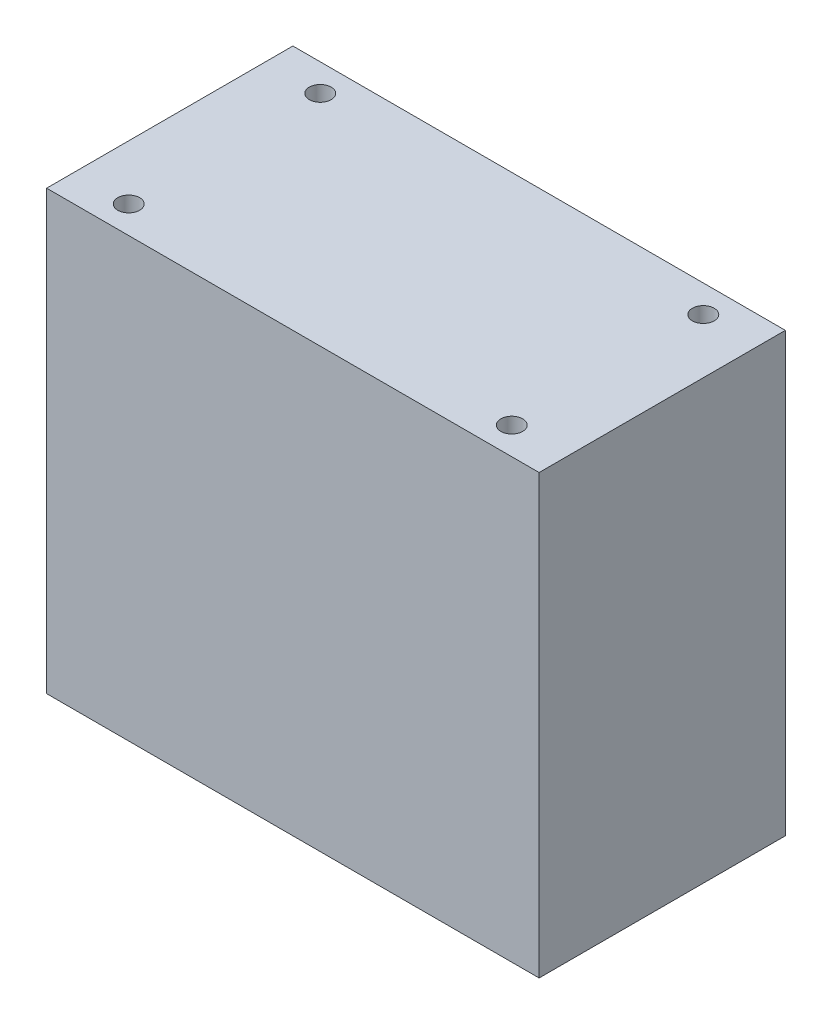
ISO-10303-21;
HEADER;
FILE_DESCRIPTION(('STEP AP214'),'2;1');
FILE_NAME('part.step','',(''),(''),'','','');
FILE_SCHEMA(('AUTOMOTIVE_DESIGN { 1 0 10303 214 1 1 1 1 }'));
ENDSEC;
DATA;
#1=APPLICATION_CONTEXT('core data for automotive mechanical design processes');
#2=APPLICATION_PROTOCOL_DEFINITION('international standard','automotive_design',2000,#1);
#3=PRODUCT_CONTEXT('',#1,'mechanical');
#4=PRODUCT('Part','Part','',(#3));
#5=PRODUCT_RELATED_PRODUCT_CATEGORY('part','',(#4));
#6=PRODUCT_DEFINITION_FORMATION('','',#4);
#7=PRODUCT_DEFINITION_CONTEXT('part definition',#1,'design');
#8=PRODUCT_DEFINITION('design','',#6,#7);
#9=PRODUCT_DEFINITION_SHAPE('','',#8);
#10=(LENGTH_UNIT() NAMED_UNIT(*) SI_UNIT(.MILLI.,.METRE.));
#11=(NAMED_UNIT(*) PLANE_ANGLE_UNIT() SI_UNIT($,.RADIAN.));
#12=(NAMED_UNIT(*) SI_UNIT($,.STERADIAN.) SOLID_ANGLE_UNIT());
#13=UNCERTAINTY_MEASURE_WITH_UNIT(LENGTH_MEASURE(1.E-05),#10,'distance_accuracy_value','');
#14=(GEOMETRIC_REPRESENTATION_CONTEXT(3) GLOBAL_UNCERTAINTY_ASSIGNED_CONTEXT((#13)) GLOBAL_UNIT_ASSIGNED_CONTEXT((#10,
#11,#12)) REPRESENTATION_CONTEXT('',''));
#15=CARTESIAN_POINT('',(0.,0.,0.));
#16=DIRECTION('',(0.,0.,1.));
#17=DIRECTION('',(1.,0.,0.));
#18=AXIS2_PLACEMENT_3D('',#15,#16,#17);
#19=CARTESIAN_POINT('',(45.,80.,0.));
#20=DIRECTION('',(1.,0.,0.));
#21=DIRECTION('',(0.,0.,-1.));
#22=AXIS2_PLACEMENT_3D('',#19,#20,#21);
#23=PLANE('',#22);
#24=DIRECTION('',(0.,0.,1.));
#25=VECTOR('',#24,1.);
#26=CARTESIAN_POINT('',(45.,0.,0.));
#27=LINE('',#26,#25);
#28=CARTESIAN_POINT('',(45.,0.,-22.5));
#29=VERTEX_POINT('',#28);
#30=CARTESIAN_POINT('',(45.,0.,22.5));
#31=VERTEX_POINT('',#30);
#32=EDGE_CURVE('E116',#29,#31,#27,.T.);
#33=ORIENTED_EDGE('',*,*,#32,.F.);
#34=DIRECTION('',(0.,-1.,0.));
#35=VECTOR('',#34,1.);
#36=CARTESIAN_POINT('',(45.,80.,-22.5));
#37=LINE('',#36,#35);
#38=CARTESIAN_POINT('',(45.,80.,-22.5));
#39=VERTEX_POINT('',#38);
#40=EDGE_CURVE('E11',#39,#29,#37,.T.);
#41=ORIENTED_EDGE('',*,*,#40,.F.);
#42=DIRECTION('',(0.,0.,1.));
#43=VECTOR('',#42,1.);
#44=CARTESIAN_POINT('',(45.,80.,0.));
#45=LINE('',#44,#43);
#46=CARTESIAN_POINT('',(45.,80.,22.5));
#47=VERTEX_POINT('',#46);
#48=EDGE_CURVE('E97',#39,#47,#45,.T.);
#49=ORIENTED_EDGE('',*,*,#48,.T.);
#50=DIRECTION('',(0.,-1.,0.));
#51=VECTOR('',#50,1.);
#52=CARTESIAN_POINT('',(45.,80.,22.5));
#53=LINE('',#52,#51);
#54=EDGE_CURVE('E76',#47,#31,#53,.T.);
#55=ORIENTED_EDGE('',*,*,#54,.T.);
#56=EDGE_LOOP('',(#33,#41,#49,#55));
#57=FACE_BOUND('',#56,.T.);
#58=ADVANCED_FACE('F36',(#57),#23,.T.);
#59=CARTESIAN_POINT('',(0.,80.,-22.5));
#60=DIRECTION('',(0.,0.,-1.));
#61=DIRECTION('',(-1.,0.,0.));
#62=AXIS2_PLACEMENT_3D('',#59,#60,#61);
#63=PLANE('',#62);
#64=DIRECTION('',(1.,0.,0.));
#65=VECTOR('',#64,1.);
#66=CARTESIAN_POINT('',(0.,0.,-22.5));
#67=LINE('',#66,#65);
#68=CARTESIAN_POINT('',(-45.,0.,-22.5));
#69=VERTEX_POINT('',#68);
#70=EDGE_CURVE('E88',#69,#29,#67,.T.);
#71=ORIENTED_EDGE('',*,*,#70,.F.);
#72=DIRECTION('',(0.,-1.,0.));
#73=VECTOR('',#72,1.);
#74=CARTESIAN_POINT('',(-45.,80.,-22.5));
#75=LINE('',#74,#73);
#76=CARTESIAN_POINT('',(-45.,80.,-22.5));
#77=VERTEX_POINT('',#76);
#78=EDGE_CURVE('E45',#77,#69,#75,.T.);
#79=ORIENTED_EDGE('',*,*,#78,.F.);
#80=DIRECTION('',(1.,0.,0.));
#81=VECTOR('',#80,1.);
#82=CARTESIAN_POINT('',(0.,80.,-22.5));
#83=LINE('',#82,#81);
#84=EDGE_CURVE('E86',#77,#39,#83,.T.);
#85=ORIENTED_EDGE('',*,*,#84,.T.);
#86=ORIENTED_EDGE('',*,*,#40,.T.);
#87=EDGE_LOOP('',(#71,#79,#85,#86));
#88=FACE_BOUND('',#87,.T.);
#89=ADVANCED_FACE('F84',(#88),#63,.T.);
#90=CARTESIAN_POINT('',(-45.,80.,0.));
#91=DIRECTION('',(1.,0.,0.));
#92=DIRECTION('',(0.,0.,-1.));
#93=AXIS2_PLACEMENT_3D('',#90,#91,#92);
#94=PLANE('',#93);
#95=DIRECTION('',(0.,0.,1.));
#96=VECTOR('',#95,1.);
#97=CARTESIAN_POINT('',(-45.,0.,0.));
#98=LINE('',#97,#96);
#99=CARTESIAN_POINT('',(-45.,0.,22.5));
#100=VERTEX_POINT('',#99);
#101=EDGE_CURVE('E119',#69,#100,#98,.T.);
#102=ORIENTED_EDGE('',*,*,#101,.T.);
#103=DIRECTION('',(0.,-1.,0.));
#104=VECTOR('',#103,1.);
#105=CARTESIAN_POINT('',(-45.,80.,22.5));
#106=LINE('',#105,#104);
#107=CARTESIAN_POINT('',(-45.,80.,22.5));
#108=VERTEX_POINT('',#107);
#109=EDGE_CURVE('E91',#108,#100,#106,.T.);
#110=ORIENTED_EDGE('',*,*,#109,.F.);
#111=DIRECTION('',(0.,0.,1.));
#112=VECTOR('',#111,1.);
#113=CARTESIAN_POINT('',(-45.,80.,0.));
#114=LINE('',#113,#112);
#115=EDGE_CURVE('E93',#77,#108,#114,.T.);
#116=ORIENTED_EDGE('',*,*,#115,.F.);
#117=ORIENTED_EDGE('',*,*,#78,.T.);
#118=EDGE_LOOP('',(#102,#110,#116,#117));
#119=FACE_BOUND('',#118,.T.);
#120=ADVANCED_FACE('F94',(#119),#94,.F.);
#121=CARTESIAN_POINT('',(-35.,80.,-17.5));
#122=DIRECTION('',(0.,-1.,0.));
#123=DIRECTION('',(0.,0.,-1.));
#124=AXIS2_PLACEMENT_3D('',#121,#122,#123);
#125=CYLINDRICAL_SURFACE('',#124,2.);
#126=CARTESIAN_POINT('',(-35.,80.,-17.5));
#127=DIRECTION('',(0.,1.,0.));
#128=DIRECTION('',(0.,0.,1.));
#129=AXIS2_PLACEMENT_3D('',#126,#127,#128);
#130=CIRCLE('',#129,2.);
#131=CARTESIAN_POINT('',(-35.,80.,-15.5));
#132=VERTEX_POINT('',#131);
#133=EDGE_CURVE('E99',#132,#132,#130,.T.);
#134=ORIENTED_EDGE('',*,*,#133,.T.);
#135=EDGE_LOOP('',(#134));
#136=FACE_BOUND('',#135,.T.);
#137=CARTESIAN_POINT('',(-35.,0.,-17.5));
#138=DIRECTION('',(0.,1.,0.));
#139=DIRECTION('',(0.,0.,1.));
#140=AXIS2_PLACEMENT_3D('',#137,#138,#139);
#141=CIRCLE('',#140,2.);
#142=CARTESIAN_POINT('',(-35.,0.,-15.5));
#143=VERTEX_POINT('',#142);
#144=EDGE_CURVE('E113',#143,#143,#141,.T.);
#145=ORIENTED_EDGE('',*,*,#144,.F.);
#146=EDGE_LOOP('',(#145));
#147=FACE_BOUND('',#146,.T.);
#148=ADVANCED_FACE('F135',(#136,#147),#125,.F.);
#149=CARTESIAN_POINT('',(-35.,80.,17.5));
#150=DIRECTION('',(0.,-1.,0.));
#151=DIRECTION('',(0.,0.,-1.));
#152=AXIS2_PLACEMENT_3D('',#149,#150,#151);
#153=CYLINDRICAL_SURFACE('',#152,2.);
#154=CARTESIAN_POINT('',(-35.,80.,17.5));
#155=DIRECTION('',(0.,1.,0.));
#156=DIRECTION('',(0.,0.,1.));
#157=AXIS2_PLACEMENT_3D('',#154,#155,#156);
#158=CIRCLE('',#157,2.);
#159=CARTESIAN_POINT('',(-35.,80.,19.5));
#160=VERTEX_POINT('',#159);
#161=EDGE_CURVE('E241',#160,#160,#158,.T.);
#162=ORIENTED_EDGE('',*,*,#161,.T.);
#163=EDGE_LOOP('',(#162));
#164=FACE_BOUND('',#163,.T.);
#165=CARTESIAN_POINT('',(-35.,0.,17.5));
#166=DIRECTION('',(0.,1.,0.));
#167=DIRECTION('',(0.,0.,1.));
#168=AXIS2_PLACEMENT_3D('',#165,#166,#167);
#169=CIRCLE('',#168,2.);
#170=CARTESIAN_POINT('',(-35.,0.,19.5));
#171=VERTEX_POINT('',#170);
#172=EDGE_CURVE('E110',#171,#171,#169,.T.);
#173=ORIENTED_EDGE('',*,*,#172,.F.);
#174=EDGE_LOOP('',(#173));
#175=FACE_BOUND('',#174,.T.);
#176=ADVANCED_FACE('F138',(#164,#175),#153,.F.);
#177=CARTESIAN_POINT('',(35.,80.,-17.5));
#178=DIRECTION('',(0.,-1.,0.));
#179=DIRECTION('',(0.,0.,-1.));
#180=AXIS2_PLACEMENT_3D('',#177,#178,#179);
#181=CYLINDRICAL_SURFACE('',#180,2.);
#182=CARTESIAN_POINT('',(35.,80.,-17.5));
#183=DIRECTION('',(0.,1.,0.));
#184=DIRECTION('',(0.,0.,1.));
#185=AXIS2_PLACEMENT_3D('',#182,#183,#184);
#186=CIRCLE('',#185,2.);
#187=CARTESIAN_POINT('',(35.,80.,-15.5));
#188=VERTEX_POINT('',#187);
#189=EDGE_CURVE('E152',#188,#188,#186,.T.);
#190=ORIENTED_EDGE('',*,*,#189,.T.);
#191=EDGE_LOOP('',(#190));
#192=FACE_BOUND('',#191,.T.);
#193=CARTESIAN_POINT('',(35.,0.,-17.5));
#194=DIRECTION('',(0.,1.,0.));
#195=DIRECTION('',(0.,0.,1.));
#196=AXIS2_PLACEMENT_3D('',#193,#194,#195);
#197=CIRCLE('',#196,2.);
#198=CARTESIAN_POINT('',(35.,0.,-15.5));
#199=VERTEX_POINT('',#198);
#200=EDGE_CURVE('E107',#199,#199,#197,.T.);
#201=ORIENTED_EDGE('',*,*,#200,.F.);
#202=EDGE_LOOP('',(#201));
#203=FACE_BOUND('',#202,.T.);
#204=ADVANCED_FACE('F141',(#192,#203),#181,.F.);
#205=CARTESIAN_POINT('',(35.,80.,17.5));
#206=DIRECTION('',(0.,-1.,0.));
#207=DIRECTION('',(0.,0.,-1.));
#208=AXIS2_PLACEMENT_3D('',#205,#206,#207);
#209=CYLINDRICAL_SURFACE('',#208,2.);
#210=CARTESIAN_POINT('',(35.,80.,17.5));
#211=DIRECTION('',(0.,1.,0.));
#212=DIRECTION('',(0.,0.,1.));
#213=AXIS2_PLACEMENT_3D('',#210,#211,#212);
#214=CIRCLE('',#213,2.);
#215=CARTESIAN_POINT('',(35.,80.,19.5));
#216=VERTEX_POINT('',#215);
#217=EDGE_CURVE('E122',#216,#216,#214,.T.);
#218=ORIENTED_EDGE('',*,*,#217,.T.);
#219=EDGE_LOOP('',(#218));
#220=FACE_BOUND('',#219,.T.);
#221=CARTESIAN_POINT('',(35.,0.,17.5));
#222=DIRECTION('',(0.,1.,0.));
#223=DIRECTION('',(0.,0.,1.));
#224=AXIS2_PLACEMENT_3D('',#221,#222,#223);
#225=CIRCLE('',#224,2.);
#226=CARTESIAN_POINT('',(35.,0.,19.5));
#227=VERTEX_POINT('',#226);
#228=EDGE_CURVE('E104',#227,#227,#225,.T.);
#229=ORIENTED_EDGE('',*,*,#228,.F.);
#230=EDGE_LOOP('',(#229));
#231=FACE_BOUND('',#230,.T.);
#232=ADVANCED_FACE('F38',(#220,#231),#209,.F.);
#233=CARTESIAN_POINT('',(0.,80.,22.5));
#234=DIRECTION('',(0.,0.,-1.));
#235=DIRECTION('',(-1.,0.,0.));
#236=AXIS2_PLACEMENT_3D('',#233,#234,#235);
#237=PLANE('',#236);
#238=DIRECTION('',(1.,0.,0.));
#239=VECTOR('',#238,1.);
#240=CARTESIAN_POINT('',(0.,0.,22.5));
#241=LINE('',#240,#239);
#242=EDGE_CURVE('E69',#100,#31,#241,.T.);
#243=ORIENTED_EDGE('',*,*,#242,.T.);
#244=ORIENTED_EDGE('',*,*,#54,.F.);
#245=DIRECTION('',(1.,0.,0.));
#246=VECTOR('',#245,1.);
#247=CARTESIAN_POINT('',(0.,80.,22.5));
#248=LINE('',#247,#246);
#249=EDGE_CURVE('E53',#108,#47,#248,.T.);
#250=ORIENTED_EDGE('',*,*,#249,.F.);
#251=ORIENTED_EDGE('',*,*,#109,.T.);
#252=EDGE_LOOP('',(#243,#244,#250,#251));
#253=FACE_BOUND('',#252,.T.);
#254=ADVANCED_FACE('F125',(#253),#237,.F.);
#255=CARTESIAN_POINT('',(0.,80.,0.));
#256=DIRECTION('',(0.,1.,0.));
#257=DIRECTION('',(0.,0.,1.));
#258=AXIS2_PLACEMENT_3D('',#255,#256,#257);
#259=PLANE('',#258);
#260=ORIENTED_EDGE('',*,*,#217,.F.);
#261=EDGE_LOOP('',(#260));
#262=FACE_BOUND('',#261,.T.);
#263=ORIENTED_EDGE('',*,*,#189,.F.);
#264=EDGE_LOOP('',(#263));
#265=FACE_BOUND('',#264,.T.);
#266=ORIENTED_EDGE('',*,*,#161,.F.);
#267=EDGE_LOOP('',(#266));
#268=FACE_BOUND('',#267,.T.);
#269=ORIENTED_EDGE('',*,*,#133,.F.);
#270=EDGE_LOOP('',(#269));
#271=FACE_BOUND('',#270,.T.);
#272=ORIENTED_EDGE('',*,*,#48,.F.);
#273=ORIENTED_EDGE('',*,*,#84,.F.);
#274=ORIENTED_EDGE('',*,*,#115,.T.);
#275=ORIENTED_EDGE('',*,*,#249,.T.);
#276=EDGE_LOOP('',(#272,#273,#274,#275));
#277=FACE_BOUND('',#276,.T.);
#278=ADVANCED_FACE('F96',(#262,#265,#268,#271,#277),#259,.T.);
#279=CARTESIAN_POINT('',(0.,0.,0.));
#280=DIRECTION('',(0.,1.,0.));
#281=DIRECTION('',(0.,0.,1.));
#282=AXIS2_PLACEMENT_3D('',#279,#280,#281);
#283=PLANE('',#282);
#284=ORIENTED_EDGE('',*,*,#228,.T.);
#285=EDGE_LOOP('',(#284));
#286=FACE_BOUND('',#285,.T.);
#287=ORIENTED_EDGE('',*,*,#200,.T.);
#288=EDGE_LOOP('',(#287));
#289=FACE_BOUND('',#288,.T.);
#290=ORIENTED_EDGE('',*,*,#172,.T.);
#291=EDGE_LOOP('',(#290));
#292=FACE_BOUND('',#291,.T.);
#293=ORIENTED_EDGE('',*,*,#144,.T.);
#294=EDGE_LOOP('',(#293));
#295=FACE_BOUND('',#294,.T.);
#296=ORIENTED_EDGE('',*,*,#32,.T.);
#297=ORIENTED_EDGE('',*,*,#242,.F.);
#298=ORIENTED_EDGE('',*,*,#101,.F.);
#299=ORIENTED_EDGE('',*,*,#70,.T.);
#300=EDGE_LOOP('',(#296,#297,#298,#299));
#301=FACE_BOUND('',#300,.T.);
#302=ADVANCED_FACE('F126',(#286,#289,#292,#295,#301),#283,.F.);
#303=CLOSED_SHELL('',(#58,#89,#120,#148,#176,#204,#232,#254,#278,#302));
#304=MANIFOLD_SOLID_BREP('B2',#303);
#305=ADVANCED_BREP_SHAPE_REPRESENTATION('',(#18,#304),#14);
#306=SHAPE_DEFINITION_REPRESENTATION(#9,#305);
ENDSEC;
END-ISO-10303-21;
